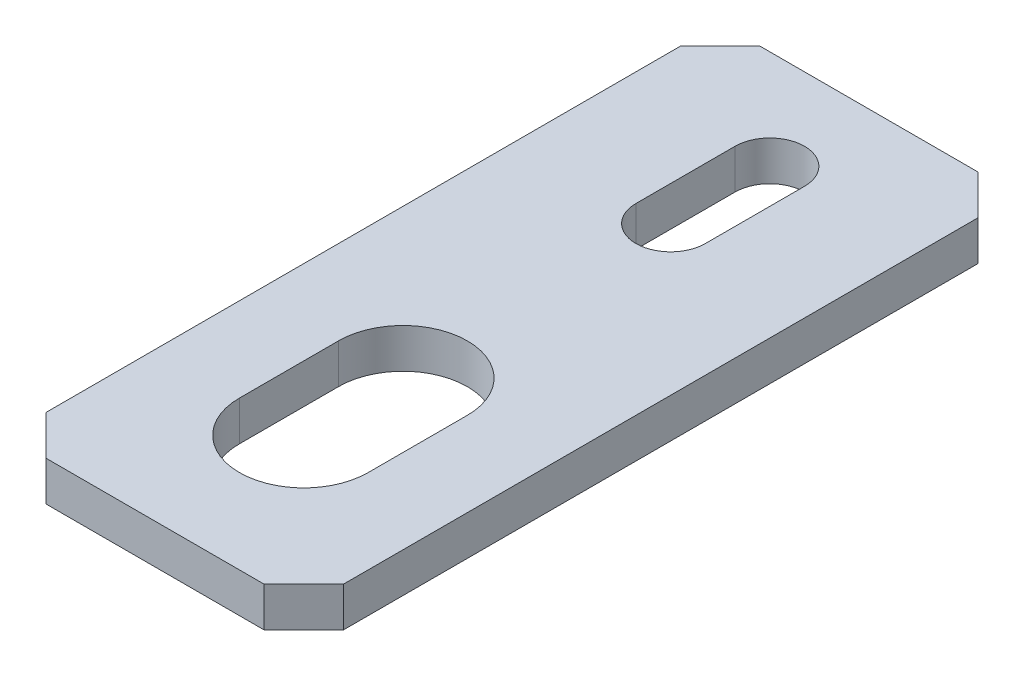
ISO-10303-21;
HEADER;
FILE_DESCRIPTION(('STEP AP214'),'2;1');
FILE_NAME('part.step','',(''),(''),'','','');
FILE_SCHEMA(('AUTOMOTIVE_DESIGN { 1 0 10303 214 1 1 1 1 }'));
ENDSEC;
DATA;
#1=APPLICATION_CONTEXT('core data for automotive mechanical design processes');
#2=APPLICATION_PROTOCOL_DEFINITION('international standard','automotive_design',2000,#1);
#3=PRODUCT_CONTEXT('',#1,'mechanical');
#4=PRODUCT('Part','Part','',(#3));
#5=PRODUCT_RELATED_PRODUCT_CATEGORY('part','',(#4));
#6=PRODUCT_DEFINITION_FORMATION('','',#4);
#7=PRODUCT_DEFINITION_CONTEXT('part definition',#1,'design');
#8=PRODUCT_DEFINITION('design','',#6,#7);
#9=PRODUCT_DEFINITION_SHAPE('','',#8);
#10=(LENGTH_UNIT() NAMED_UNIT(*) SI_UNIT(.MILLI.,.METRE.));
#11=(NAMED_UNIT(*) PLANE_ANGLE_UNIT() SI_UNIT($,.RADIAN.));
#12=(NAMED_UNIT(*) SI_UNIT($,.STERADIAN.) SOLID_ANGLE_UNIT());
#13=UNCERTAINTY_MEASURE_WITH_UNIT(LENGTH_MEASURE(1.E-05),#10,'distance_accuracy_value','');
#14=(GEOMETRIC_REPRESENTATION_CONTEXT(3) GLOBAL_UNCERTAINTY_ASSIGNED_CONTEXT((#13)) GLOBAL_UNIT_ASSIGNED_CONTEXT((#10,
#11,#12)) REPRESENTATION_CONTEXT('',''));
#15=CARTESIAN_POINT('',(0.,0.,0.));
#16=DIRECTION('',(0.,0.,1.));
#17=DIRECTION('',(1.,0.,0.));
#18=AXIS2_PLACEMENT_3D('',#15,#16,#17);
#19=CARTESIAN_POINT('',(-13.,2.,-36.));
#20=DIRECTION('',(0.707106781186548,0.,0.707106781186547));
#21=DIRECTION('',(0.707106781186547,0.,-0.707106781186548));
#22=AXIS2_PLACEMENT_3D('',#19,#20,#21);
#23=PLANE('',#22);
#24=DIRECTION('',(-0.707106781186547,0.,0.707106781186548));
#25=VECTOR('',#24,1.);
#26=CARTESIAN_POINT('',(-13.,0.,-36.));
#27=LINE('',#26,#25);
#28=CARTESIAN_POINT('',(-13.,0.,-36.));
#29=VERTEX_POINT('',#28);
#30=CARTESIAN_POINT('',(-15.,0.,-34.));
#31=VERTEX_POINT('',#30);
#32=EDGE_CURVE('E11',#29,#31,#27,.T.);
#33=ORIENTED_EDGE('',*,*,#32,.T.);
#34=DIRECTION('',(0.,-1.,0.));
#35=VECTOR('',#34,1.);
#36=CARTESIAN_POINT('',(-15.,2.,-34.));
#37=LINE('',#36,#35);
#38=CARTESIAN_POINT('',(-15.,2.,-34.));
#39=VERTEX_POINT('',#38);
#40=EDGE_CURVE('E25',#39,#31,#37,.T.);
#41=ORIENTED_EDGE('',*,*,#40,.F.);
#42=DIRECTION('',(-0.707106781186547,0.,0.707106781186548));
#43=VECTOR('',#42,1.);
#44=CARTESIAN_POINT('',(-13.,2.,-36.));
#45=LINE('',#44,#43);
#46=CARTESIAN_POINT('',(-13.,2.,-36.));
#47=VERTEX_POINT('',#46);
#48=EDGE_CURVE('E343',#47,#39,#45,.T.);
#49=ORIENTED_EDGE('',*,*,#48,.F.);
#50=DIRECTION('',(0.,-1.,0.));
#51=VECTOR('',#50,1.);
#52=CARTESIAN_POINT('',(-13.,2.,-36.));
#53=LINE('',#52,#51);
#54=EDGE_CURVE('E339',#47,#29,#53,.T.);
#55=ORIENTED_EDGE('',*,*,#54,.T.);
#56=EDGE_LOOP('',(#33,#41,#49,#55));
#57=FACE_BOUND('',#56,.T.);
#58=ADVANCED_FACE('F17',(#57),#23,.F.);
#59=CARTESIAN_POINT('',(-2.,2.,-36.));
#60=DIRECTION('',(0.,0.,1.));
#61=DIRECTION('',(1.,0.,0.));
#62=AXIS2_PLACEMENT_3D('',#59,#60,#61);
#63=PLANE('',#62);
#64=DIRECTION('',(-1.,0.,0.));
#65=VECTOR('',#64,1.);
#66=CARTESIAN_POINT('',(-2.,0.,-36.));
#67=LINE('',#66,#65);
#68=CARTESIAN_POINT('',(-2.,0.,-36.));
#69=VERTEX_POINT('',#68);
#70=EDGE_CURVE('E334',#69,#29,#67,.T.);
#71=ORIENTED_EDGE('',*,*,#70,.T.);
#72=ORIENTED_EDGE('',*,*,#54,.F.);
#73=DIRECTION('',(-1.,0.,0.));
#74=VECTOR('',#73,1.);
#75=CARTESIAN_POINT('',(-2.,2.,-36.));
#76=LINE('',#75,#74);
#77=CARTESIAN_POINT('',(-2.,2.,-36.));
#78=VERTEX_POINT('',#77);
#79=EDGE_CURVE('E329',#78,#47,#76,.T.);
#80=ORIENTED_EDGE('',*,*,#79,.F.);
#81=DIRECTION('',(0.,-1.,0.));
#82=VECTOR('',#81,1.);
#83=CARTESIAN_POINT('',(-2.,2.,-36.));
#84=LINE('',#83,#82);
#85=EDGE_CURVE('E325',#78,#69,#84,.T.);
#86=ORIENTED_EDGE('',*,*,#85,.T.);
#87=EDGE_LOOP('',(#71,#72,#80,#86));
#88=FACE_BOUND('',#87,.T.);
#89=ADVANCED_FACE('F361',(#88),#63,.F.);
#90=CARTESIAN_POINT('',(0.,2.,-34.));
#91=DIRECTION('',(-0.707106781186548,0.,0.707106781186547));
#92=DIRECTION('',(0.707106781186547,0.,0.707106781186548));
#93=AXIS2_PLACEMENT_3D('',#90,#91,#92);
#94=PLANE('',#93);
#95=DIRECTION('',(-0.707106781186547,0.,-0.707106781186548));
#96=VECTOR('',#95,1.);
#97=CARTESIAN_POINT('',(0.,0.,-34.));
#98=LINE('',#97,#96);
#99=CARTESIAN_POINT('',(0.,0.,-34.));
#100=VERTEX_POINT('',#99);
#101=EDGE_CURVE('E320',#100,#69,#98,.T.);
#102=ORIENTED_EDGE('',*,*,#101,.T.);
#103=ORIENTED_EDGE('',*,*,#85,.F.);
#104=DIRECTION('',(-0.707106781186547,0.,-0.707106781186548));
#105=VECTOR('',#104,1.);
#106=CARTESIAN_POINT('',(0.,2.,-34.));
#107=LINE('',#106,#105);
#108=CARTESIAN_POINT('',(0.,2.,-34.));
#109=VERTEX_POINT('',#108);
#110=EDGE_CURVE('E315',#109,#78,#107,.T.);
#111=ORIENTED_EDGE('',*,*,#110,.F.);
#112=DIRECTION('',(0.,-1.,0.));
#113=VECTOR('',#112,1.);
#114=CARTESIAN_POINT('',(0.,2.,-34.));
#115=LINE('',#114,#113);
#116=EDGE_CURVE('E311',#109,#100,#115,.T.);
#117=ORIENTED_EDGE('',*,*,#116,.T.);
#118=EDGE_LOOP('',(#102,#103,#111,#117));
#119=FACE_BOUND('',#118,.T.);
#120=ADVANCED_FACE('F381',(#119),#94,.F.);
#121=CARTESIAN_POINT('',(0.,2.,-2.));
#122=DIRECTION('',(-1.,0.,0.));
#123=DIRECTION('',(0.,0.,1.));
#124=AXIS2_PLACEMENT_3D('',#121,#122,#123);
#125=PLANE('',#124);
#126=DIRECTION('',(0.,0.,-1.));
#127=VECTOR('',#126,1.);
#128=CARTESIAN_POINT('',(0.,0.,-2.));
#129=LINE('',#128,#127);
#130=CARTESIAN_POINT('',(0.,0.,-2.));
#131=VERTEX_POINT('',#130);
#132=EDGE_CURVE('E306',#131,#100,#129,.T.);
#133=ORIENTED_EDGE('',*,*,#132,.T.);
#134=ORIENTED_EDGE('',*,*,#116,.F.);
#135=DIRECTION('',(0.,0.,-1.));
#136=VECTOR('',#135,1.);
#137=CARTESIAN_POINT('',(0.,2.,-2.));
#138=LINE('',#137,#136);
#139=CARTESIAN_POINT('',(0.,2.,-2.));
#140=VERTEX_POINT('',#139);
#141=EDGE_CURVE('E301',#140,#109,#138,.T.);
#142=ORIENTED_EDGE('',*,*,#141,.F.);
#143=DIRECTION('',(0.,-1.,0.));
#144=VECTOR('',#143,1.);
#145=CARTESIAN_POINT('',(0.,2.,-2.));
#146=LINE('',#145,#144);
#147=EDGE_CURVE('E297',#140,#131,#146,.T.);
#148=ORIENTED_EDGE('',*,*,#147,.T.);
#149=EDGE_LOOP('',(#133,#134,#142,#148));
#150=FACE_BOUND('',#149,.T.);
#151=ADVANCED_FACE('F378',(#150),#125,.F.);
#152=CARTESIAN_POINT('',(-2.,2.,0.));
#153=DIRECTION('',(-0.707106781186548,0.,-0.707106781186548));
#154=DIRECTION('',(-0.707106781186548,0.,0.707106781186548));
#155=AXIS2_PLACEMENT_3D('',#152,#153,#154);
#156=PLANE('',#155);
#157=DIRECTION('',(0.707106781186548,0.,-0.707106781186548));
#158=VECTOR('',#157,1.);
#159=CARTESIAN_POINT('',(-2.,0.,0.));
#160=LINE('',#159,#158);
#161=CARTESIAN_POINT('',(-2.,0.,0.));
#162=VERTEX_POINT('',#161);
#163=EDGE_CURVE('E292',#162,#131,#160,.T.);
#164=ORIENTED_EDGE('',*,*,#163,.T.);
#165=ORIENTED_EDGE('',*,*,#147,.F.);
#166=DIRECTION('',(0.707106781186548,0.,-0.707106781186548));
#167=VECTOR('',#166,1.);
#168=CARTESIAN_POINT('',(-2.,2.,0.));
#169=LINE('',#168,#167);
#170=CARTESIAN_POINT('',(-2.,2.,0.));
#171=VERTEX_POINT('',#170);
#172=EDGE_CURVE('E287',#171,#140,#169,.T.);
#173=ORIENTED_EDGE('',*,*,#172,.F.);
#174=DIRECTION('',(0.,-1.,0.));
#175=VECTOR('',#174,1.);
#176=CARTESIAN_POINT('',(-2.,2.,0.));
#177=LINE('',#176,#175);
#178=EDGE_CURVE('E283',#171,#162,#177,.T.);
#179=ORIENTED_EDGE('',*,*,#178,.T.);
#180=EDGE_LOOP('',(#164,#165,#173,#179));
#181=FACE_BOUND('',#180,.T.);
#182=ADVANCED_FACE('F375',(#181),#156,.F.);
#183=CARTESIAN_POINT('',(-13.,2.,0.));
#184=DIRECTION('',(0.,0.,-1.));
#185=DIRECTION('',(-1.,0.,0.));
#186=AXIS2_PLACEMENT_3D('',#183,#184,#185);
#187=PLANE('',#186);
#188=DIRECTION('',(1.,0.,0.));
#189=VECTOR('',#188,1.);
#190=CARTESIAN_POINT('',(-13.,0.,0.));
#191=LINE('',#190,#189);
#192=CARTESIAN_POINT('',(-13.,0.,0.));
#193=VERTEX_POINT('',#192);
#194=EDGE_CURVE('E278',#193,#162,#191,.T.);
#195=ORIENTED_EDGE('',*,*,#194,.T.);
#196=ORIENTED_EDGE('',*,*,#178,.F.);
#197=DIRECTION('',(1.,0.,0.));
#198=VECTOR('',#197,1.);
#199=CARTESIAN_POINT('',(-13.,2.,0.));
#200=LINE('',#199,#198);
#201=CARTESIAN_POINT('',(-13.,2.,0.));
#202=VERTEX_POINT('',#201);
#203=EDGE_CURVE('E273',#202,#171,#200,.T.);
#204=ORIENTED_EDGE('',*,*,#203,.F.);
#205=DIRECTION('',(0.,-1.,0.));
#206=VECTOR('',#205,1.);
#207=CARTESIAN_POINT('',(-13.,2.,0.));
#208=LINE('',#207,#206);
#209=EDGE_CURVE('E269',#202,#193,#208,.T.);
#210=ORIENTED_EDGE('',*,*,#209,.T.);
#211=EDGE_LOOP('',(#195,#196,#204,#210));
#212=FACE_BOUND('',#211,.T.);
#213=ADVANCED_FACE('F373',(#212),#187,.F.);
#214=CARTESIAN_POINT('',(-15.,2.,-2.));
#215=DIRECTION('',(0.707106781186548,0.,-0.707106781186547));
#216=DIRECTION('',(-0.707106781186547,0.,-0.707106781186548));
#217=AXIS2_PLACEMENT_3D('',#214,#215,#216);
#218=PLANE('',#217);
#219=DIRECTION('',(0.707106781186547,0.,0.707106781186548));
#220=VECTOR('',#219,1.);
#221=CARTESIAN_POINT('',(-15.,0.,-2.));
#222=LINE('',#221,#220);
#223=CARTESIAN_POINT('',(-15.,0.,-2.));
#224=VERTEX_POINT('',#223);
#225=EDGE_CURVE('E264',#224,#193,#222,.T.);
#226=ORIENTED_EDGE('',*,*,#225,.T.);
#227=ORIENTED_EDGE('',*,*,#209,.F.);
#228=DIRECTION('',(0.707106781186547,0.,0.707106781186548));
#229=VECTOR('',#228,1.);
#230=CARTESIAN_POINT('',(-15.,2.,-2.));
#231=LINE('',#230,#229);
#232=CARTESIAN_POINT('',(-15.,2.,-2.));
#233=VERTEX_POINT('',#232);
#234=EDGE_CURVE('E259',#233,#202,#231,.T.);
#235=ORIENTED_EDGE('',*,*,#234,.F.);
#236=DIRECTION('',(0.,-1.,0.));
#237=VECTOR('',#236,1.);
#238=CARTESIAN_POINT('',(-15.,2.,-2.));
#239=LINE('',#238,#237);
#240=EDGE_CURVE('E255',#233,#224,#239,.T.);
#241=ORIENTED_EDGE('',*,*,#240,.T.);
#242=EDGE_LOOP('',(#226,#227,#235,#241));
#243=FACE_BOUND('',#242,.T.);
#244=ADVANCED_FACE('F369',(#243),#218,.F.);
#245=CARTESIAN_POINT('',(-15.,2.,-34.));
#246=DIRECTION('',(1.,0.,0.));
#247=DIRECTION('',(0.,0.,-1.));
#248=AXIS2_PLACEMENT_3D('',#245,#246,#247);
#249=PLANE('',#248);
#250=DIRECTION('',(0.,0.,1.));
#251=VECTOR('',#250,1.);
#252=CARTESIAN_POINT('',(-15.,0.,-34.));
#253=LINE('',#252,#251);
#254=EDGE_CURVE('E250',#31,#224,#253,.T.);
#255=ORIENTED_EDGE('',*,*,#254,.T.);
#256=ORIENTED_EDGE('',*,*,#240,.F.);
#257=DIRECTION('',(0.,0.,1.));
#258=VECTOR('',#257,1.);
#259=CARTESIAN_POINT('',(-15.,2.,-34.));
#260=LINE('',#259,#258);
#261=EDGE_CURVE('E245',#39,#233,#260,.T.);
#262=ORIENTED_EDGE('',*,*,#261,.F.);
#263=ORIENTED_EDGE('',*,*,#40,.T.);
#264=EDGE_LOOP('',(#255,#256,#262,#263));
#265=FACE_BOUND('',#264,.T.);
#266=ADVANCED_FACE('F353',(#265),#249,.F.);
#267=CARTESIAN_POINT('',(0.,2.,0.));
#268=DIRECTION('',(0.,1.,0.));
#269=DIRECTION('',(0.,0.,1.));
#270=AXIS2_PLACEMENT_3D('',#267,#268,#269);
#271=PLANE('',#270);
#272=CARTESIAN_POINT('',(-7.5,2.,-26.));
#273=DIRECTION('',(0.,1.,0.));
#274=DIRECTION('',(1.,0.,0.));
#275=AXIS2_PLACEMENT_3D('',#272,#273,#274);
#276=CIRCLE('',#275,1.75);
#277=CARTESIAN_POINT('',(-9.25,2.,-26.));
#278=VERTEX_POINT('',#277);
#279=CARTESIAN_POINT('',(-5.75,2.,-26.));
#280=VERTEX_POINT('',#279);
#281=EDGE_CURVE('E240',#278,#280,#276,.T.);
#282=ORIENTED_EDGE('',*,*,#281,.F.);
#283=DIRECTION('',(0.,0.,1.));
#284=VECTOR('',#283,1.);
#285=CARTESIAN_POINT('',(-9.25,2.,-31.));
#286=LINE('',#285,#284);
#287=CARTESIAN_POINT('',(-9.25,2.,-31.));
#288=VERTEX_POINT('',#287);
#289=EDGE_CURVE('E236',#288,#278,#286,.T.);
#290=ORIENTED_EDGE('',*,*,#289,.F.);
#291=CARTESIAN_POINT('',(-7.5,2.,-31.));
#292=DIRECTION('',(0.,1.,0.));
#293=DIRECTION('',(1.,0.,0.));
#294=AXIS2_PLACEMENT_3D('',#291,#292,#293);
#295=CIRCLE('',#294,1.75);
#296=CARTESIAN_POINT('',(-5.75,2.,-31.));
#297=VERTEX_POINT('',#296);
#298=EDGE_CURVE('E152',#297,#288,#295,.T.);
#299=ORIENTED_EDGE('',*,*,#298,.F.);
#300=DIRECTION('',(0.,0.,-1.));
#301=VECTOR('',#300,1.);
#302=CARTESIAN_POINT('',(-5.75,2.,-26.));
#303=LINE('',#302,#301);
#304=EDGE_CURVE('E228',#280,#297,#303,.T.);
#305=ORIENTED_EDGE('',*,*,#304,.F.);
#306=EDGE_LOOP('',(#282,#290,#299,#305));
#307=FACE_BOUND('',#306,.T.);
#308=CARTESIAN_POINT('',(-7.5,2.,-7.5));
#309=DIRECTION('',(0.,1.,0.));
#310=DIRECTION('',(1.,0.,0.));
#311=AXIS2_PLACEMENT_3D('',#308,#309,#310);
#312=CIRCLE('',#311,3.25);
#313=CARTESIAN_POINT('',(-10.75,2.,-7.5));
#314=VERTEX_POINT('',#313);
#315=CARTESIAN_POINT('',(-4.25,2.,-7.5));
#316=VERTEX_POINT('',#315);
#317=EDGE_CURVE('E223',#314,#316,#312,.T.);
#318=ORIENTED_EDGE('',*,*,#317,.F.);
#319=DIRECTION('',(0.,0.,1.));
#320=VECTOR('',#319,1.);
#321=CARTESIAN_POINT('',(-10.75,2.,-12.5));
#322=LINE('',#321,#320);
#323=CARTESIAN_POINT('',(-10.75,2.,-12.5));
#324=VERTEX_POINT('',#323);
#325=EDGE_CURVE('E218',#324,#314,#322,.T.);
#326=ORIENTED_EDGE('',*,*,#325,.F.);
#327=CARTESIAN_POINT('',(-7.5,2.,-12.5));
#328=DIRECTION('',(0.,1.,0.));
#329=DIRECTION('',(1.,0.,0.));
#330=AXIS2_PLACEMENT_3D('',#327,#328,#329);
#331=CIRCLE('',#330,3.25);
#332=CARTESIAN_POINT('',(-4.25,2.,-12.5));
#333=VERTEX_POINT('',#332);
#334=EDGE_CURVE('E213',#333,#324,#331,.T.);
#335=ORIENTED_EDGE('',*,*,#334,.F.);
#336=DIRECTION('',(0.,0.,-1.));
#337=VECTOR('',#336,1.);
#338=CARTESIAN_POINT('',(-4.25,2.,-7.5));
#339=LINE('',#338,#337);
#340=EDGE_CURVE('E208',#316,#333,#339,.T.);
#341=ORIENTED_EDGE('',*,*,#340,.F.);
#342=EDGE_LOOP('',(#318,#326,#335,#341));
#343=FACE_BOUND('',#342,.T.);
#344=ORIENTED_EDGE('',*,*,#48,.T.);
#345=ORIENTED_EDGE('',*,*,#261,.T.);
#346=ORIENTED_EDGE('',*,*,#234,.T.);
#347=ORIENTED_EDGE('',*,*,#203,.T.);
#348=ORIENTED_EDGE('',*,*,#172,.T.);
#349=ORIENTED_EDGE('',*,*,#141,.T.);
#350=ORIENTED_EDGE('',*,*,#110,.T.);
#351=ORIENTED_EDGE('',*,*,#79,.T.);
#352=EDGE_LOOP('',(#344,#345,#346,#347,#348,#349,#350,#351));
#353=FACE_BOUND('',#352,.T.);
#354=ADVANCED_FACE('F357',(#307,#343,#353),#271,.T.);
#355=CARTESIAN_POINT('',(-4.25,2.,-7.5));
#356=DIRECTION('',(-1.,0.,0.));
#357=DIRECTION('',(0.,0.,1.));
#358=AXIS2_PLACEMENT_3D('',#355,#356,#357);
#359=PLANE('',#358);
#360=DIRECTION('',(0.,0.,-1.));
#361=VECTOR('',#360,1.);
#362=CARTESIAN_POINT('',(-4.25,0.,-7.5));
#363=LINE('',#362,#361);
#364=CARTESIAN_POINT('',(-4.25,0.,-7.5));
#365=VERTEX_POINT('',#364);
#366=CARTESIAN_POINT('',(-4.25,0.,-12.5));
#367=VERTEX_POINT('',#366);
#368=EDGE_CURVE('E203',#365,#367,#363,.T.);
#369=ORIENTED_EDGE('',*,*,#368,.F.);
#370=DIRECTION('',(0.,-1.,0.));
#371=VECTOR('',#370,1.);
#372=CARTESIAN_POINT('',(-4.25,2.,-7.5));
#373=LINE('',#372,#371);
#374=EDGE_CURVE('E198',#316,#365,#373,.T.);
#375=ORIENTED_EDGE('',*,*,#374,.F.);
#376=ORIENTED_EDGE('',*,*,#340,.T.);
#377=DIRECTION('',(0.,-1.,0.));
#378=VECTOR('',#377,1.);
#379=CARTESIAN_POINT('',(-4.25,2.,-12.5));
#380=LINE('',#379,#378);
#381=EDGE_CURVE('E194',#333,#367,#380,.T.);
#382=ORIENTED_EDGE('',*,*,#381,.T.);
#383=EDGE_LOOP('',(#369,#375,#376,#382));
#384=FACE_BOUND('',#383,.T.);
#385=ADVANCED_FACE('F460',(#384),#359,.T.);
#386=CARTESIAN_POINT('',(-7.5,2.,-12.5));
#387=DIRECTION('',(0.,-1.,0.));
#388=DIRECTION('',(0.,0.,1.));
#389=AXIS2_PLACEMENT_3D('',#386,#387,#388);
#390=CYLINDRICAL_SURFACE('',#389,3.25);
#391=CARTESIAN_POINT('',(-7.5,0.,-12.5));
#392=DIRECTION('',(0.,1.,0.));
#393=DIRECTION('',(1.,0.,0.));
#394=AXIS2_PLACEMENT_3D('',#391,#392,#393);
#395=CIRCLE('',#394,3.25);
#396=CARTESIAN_POINT('',(-10.75,0.,-12.5));
#397=VERTEX_POINT('',#396);
#398=EDGE_CURVE('E189',#367,#397,#395,.T.);
#399=ORIENTED_EDGE('',*,*,#398,.F.);
#400=ORIENTED_EDGE('',*,*,#381,.F.);
#401=ORIENTED_EDGE('',*,*,#334,.T.);
#402=DIRECTION('',(0.,-1.,0.));
#403=VECTOR('',#402,1.);
#404=CARTESIAN_POINT('',(-10.75,2.,-12.5));
#405=LINE('',#404,#403);
#406=EDGE_CURVE('E185',#324,#397,#405,.T.);
#407=ORIENTED_EDGE('',*,*,#406,.T.);
#408=EDGE_LOOP('',(#399,#400,#401,#407));
#409=FACE_BOUND('',#408,.T.);
#410=ADVANCED_FACE('F471',(#409),#390,.F.);
#411=CARTESIAN_POINT('',(-10.75,2.,-12.5));
#412=DIRECTION('',(1.,0.,0.));
#413=DIRECTION('',(0.,0.,-1.));
#414=AXIS2_PLACEMENT_3D('',#411,#412,#413);
#415=PLANE('',#414);
#416=DIRECTION('',(0.,0.,1.));
#417=VECTOR('',#416,1.);
#418=CARTESIAN_POINT('',(-10.75,0.,-12.5));
#419=LINE('',#418,#417);
#420=CARTESIAN_POINT('',(-10.75,0.,-7.5));
#421=VERTEX_POINT('',#420);
#422=EDGE_CURVE('E180',#397,#421,#419,.T.);
#423=ORIENTED_EDGE('',*,*,#422,.F.);
#424=ORIENTED_EDGE('',*,*,#406,.F.);
#425=ORIENTED_EDGE('',*,*,#325,.T.);
#426=DIRECTION('',(0.,-1.,0.));
#427=VECTOR('',#426,1.);
#428=CARTESIAN_POINT('',(-10.75,2.,-7.5));
#429=LINE('',#428,#427);
#430=EDGE_CURVE('E176',#314,#421,#429,.T.);
#431=ORIENTED_EDGE('',*,*,#430,.T.);
#432=EDGE_LOOP('',(#423,#424,#425,#431));
#433=FACE_BOUND('',#432,.T.);
#434=ADVANCED_FACE('F482',(#433),#415,.T.);
#435=CARTESIAN_POINT('',(-7.5,2.,-7.5));
#436=DIRECTION('',(0.,-1.,0.));
#437=DIRECTION('',(0.,0.,-1.));
#438=AXIS2_PLACEMENT_3D('',#435,#436,#437);
#439=CYLINDRICAL_SURFACE('',#438,3.25);
#440=CARTESIAN_POINT('',(-7.5,0.,-7.5));
#441=DIRECTION('',(0.,1.,0.));
#442=DIRECTION('',(1.,0.,0.));
#443=AXIS2_PLACEMENT_3D('',#440,#441,#442);
#444=CIRCLE('',#443,3.25);
#445=EDGE_CURVE('E148',#421,#365,#444,.T.);
#446=ORIENTED_EDGE('',*,*,#445,.F.);
#447=ORIENTED_EDGE('',*,*,#430,.F.);
#448=ORIENTED_EDGE('',*,*,#317,.T.);
#449=ORIENTED_EDGE('',*,*,#374,.T.);
#450=EDGE_LOOP('',(#446,#447,#448,#449));
#451=FACE_BOUND('',#450,.T.);
#452=ADVANCED_FACE('F493',(#451),#439,.F.);
#453=CARTESIAN_POINT('',(0.,0.,0.));
#454=DIRECTION('',(0.,1.,0.));
#455=DIRECTION('',(0.,0.,1.));
#456=AXIS2_PLACEMENT_3D('',#453,#454,#455);
#457=PLANE('',#456);
#458=DIRECTION('',(0.,0.,1.));
#459=VECTOR('',#458,1.);
#460=CARTESIAN_POINT('',(-9.25,0.,-31.));
#461=LINE('',#460,#459);
#462=CARTESIAN_POINT('',(-9.25,0.,-31.));
#463=VERTEX_POINT('',#462);
#464=CARTESIAN_POINT('',(-9.25,0.,-26.));
#465=VERTEX_POINT('',#464);
#466=EDGE_CURVE('E129',#463,#465,#461,.T.);
#467=ORIENTED_EDGE('',*,*,#466,.T.);
#468=CARTESIAN_POINT('',(-7.5,0.,-26.));
#469=DIRECTION('',(0.,1.,0.));
#470=DIRECTION('',(1.,0.,0.));
#471=AXIS2_PLACEMENT_3D('',#468,#469,#470);
#472=CIRCLE('',#471,1.75);
#473=CARTESIAN_POINT('',(-5.75,0.,-26.));
#474=VERTEX_POINT('',#473);
#475=EDGE_CURVE('E149',#465,#474,#472,.T.);
#476=ORIENTED_EDGE('',*,*,#475,.T.);
#477=DIRECTION('',(0.,0.,-1.));
#478=VECTOR('',#477,1.);
#479=CARTESIAN_POINT('',(-5.75,0.,-26.));
#480=LINE('',#479,#478);
#481=CARTESIAN_POINT('',(-5.75,0.,-31.));
#482=VERTEX_POINT('',#481);
#483=EDGE_CURVE('E132',#474,#482,#480,.T.);
#484=ORIENTED_EDGE('',*,*,#483,.T.);
#485=CARTESIAN_POINT('',(-7.5,0.,-31.));
#486=DIRECTION('',(0.,1.,0.));
#487=DIRECTION('',(1.,0.,0.));
#488=AXIS2_PLACEMENT_3D('',#485,#486,#487);
#489=CIRCLE('',#488,1.75);
#490=EDGE_CURVE('E125',#482,#463,#489,.T.);
#491=ORIENTED_EDGE('',*,*,#490,.T.);
#492=EDGE_LOOP('',(#467,#476,#484,#491));
#493=FACE_BOUND('',#492,.T.);
#494=ORIENTED_EDGE('',*,*,#422,.T.);
#495=ORIENTED_EDGE('',*,*,#445,.T.);
#496=ORIENTED_EDGE('',*,*,#368,.T.);
#497=ORIENTED_EDGE('',*,*,#398,.T.);
#498=EDGE_LOOP('',(#494,#495,#496,#497));
#499=FACE_BOUND('',#498,.T.);
#500=ORIENTED_EDGE('',*,*,#32,.F.);
#501=ORIENTED_EDGE('',*,*,#70,.F.);
#502=ORIENTED_EDGE('',*,*,#101,.F.);
#503=ORIENTED_EDGE('',*,*,#132,.F.);
#504=ORIENTED_EDGE('',*,*,#163,.F.);
#505=ORIENTED_EDGE('',*,*,#194,.F.);
#506=ORIENTED_EDGE('',*,*,#225,.F.);
#507=ORIENTED_EDGE('',*,*,#254,.F.);
#508=EDGE_LOOP('',(#500,#501,#502,#503,#504,#505,#506,#507));
#509=FACE_BOUND('',#508,.T.);
#510=ADVANCED_FACE('F127',(#493,#499,#509),#457,.F.);
#511=CARTESIAN_POINT('',(-7.5,2.,-31.));
#512=DIRECTION('',(0.,-1.,0.));
#513=DIRECTION('',(0.,0.,1.));
#514=AXIS2_PLACEMENT_3D('',#511,#512,#513);
#515=CYLINDRICAL_SURFACE('',#514,1.75);
#516=ORIENTED_EDGE('',*,*,#490,.F.);
#517=DIRECTION('',(0.,-1.,0.));
#518=VECTOR('',#517,1.);
#519=CARTESIAN_POINT('',(-5.75,2.,-31.));
#520=LINE('',#519,#518);
#521=EDGE_CURVE('E137',#297,#482,#520,.T.);
#522=ORIENTED_EDGE('',*,*,#521,.F.);
#523=ORIENTED_EDGE('',*,*,#298,.T.);
#524=DIRECTION('',(0.,-1.,0.));
#525=VECTOR('',#524,1.);
#526=CARTESIAN_POINT('',(-9.25,2.,-31.));
#527=LINE('',#526,#525);
#528=EDGE_CURVE('E143',#288,#463,#527,.T.);
#529=ORIENTED_EDGE('',*,*,#528,.T.);
#530=EDGE_LOOP('',(#516,#522,#523,#529));
#531=FACE_BOUND('',#530,.T.);
#532=ADVANCED_FACE('F151',(#531),#515,.F.);
#533=CARTESIAN_POINT('',(-9.25,2.,-31.));
#534=DIRECTION('',(1.,0.,0.));
#535=DIRECTION('',(0.,0.,-1.));
#536=AXIS2_PLACEMENT_3D('',#533,#534,#535);
#537=PLANE('',#536);
#538=ORIENTED_EDGE('',*,*,#466,.F.);
#539=ORIENTED_EDGE('',*,*,#528,.F.);
#540=ORIENTED_EDGE('',*,*,#289,.T.);
#541=DIRECTION('',(0.,-1.,0.));
#542=VECTOR('',#541,1.);
#543=CARTESIAN_POINT('',(-9.25,2.,-26.));
#544=LINE('',#543,#542);
#545=EDGE_CURVE('E146',#278,#465,#544,.T.);
#546=ORIENTED_EDGE('',*,*,#545,.T.);
#547=EDGE_LOOP('',(#538,#539,#540,#546));
#548=FACE_BOUND('',#547,.T.);
#549=ADVANCED_FACE('F141',(#548),#537,.T.);
#550=CARTESIAN_POINT('',(-7.5,2.,-26.));
#551=DIRECTION('',(0.,-1.,0.));
#552=DIRECTION('',(0.,0.,-1.));
#553=AXIS2_PLACEMENT_3D('',#550,#551,#552);
#554=CYLINDRICAL_SURFACE('',#553,1.75);
#555=ORIENTED_EDGE('',*,*,#475,.F.);
#556=ORIENTED_EDGE('',*,*,#545,.F.);
#557=ORIENTED_EDGE('',*,*,#281,.T.);
#558=DIRECTION('',(0.,-1.,0.));
#559=VECTOR('',#558,1.);
#560=CARTESIAN_POINT('',(-5.75,2.,-26.));
#561=LINE('',#560,#559);
#562=EDGE_CURVE('E155',#280,#474,#561,.T.);
#563=ORIENTED_EDGE('',*,*,#562,.T.);
#564=EDGE_LOOP('',(#555,#556,#557,#563));
#565=FACE_BOUND('',#564,.T.);
#566=ADVANCED_FACE('F532',(#565),#554,.F.);
#567=CARTESIAN_POINT('',(-5.75,2.,-26.));
#568=DIRECTION('',(-1.,0.,0.));
#569=DIRECTION('',(0.,0.,1.));
#570=AXIS2_PLACEMENT_3D('',#567,#568,#569);
#571=PLANE('',#570);
#572=ORIENTED_EDGE('',*,*,#483,.F.);
#573=ORIENTED_EDGE('',*,*,#562,.F.);
#574=ORIENTED_EDGE('',*,*,#304,.T.);
#575=ORIENTED_EDGE('',*,*,#521,.T.);
#576=EDGE_LOOP('',(#572,#573,#574,#575));
#577=FACE_BOUND('',#576,.T.);
#578=ADVANCED_FACE('F542',(#577),#571,.T.);
#579=CLOSED_SHELL('',(#58,#89,#120,#151,#182,#213,#244,#266,#354,#385,#410,#434,#452,#510,#532,
#549,#566,#578));
#580=MANIFOLD_SOLID_BREP('B1',#579);
#581=ADVANCED_BREP_SHAPE_REPRESENTATION('',(#18,#580),#14);
#582=SHAPE_DEFINITION_REPRESENTATION(#9,#581);
ENDSEC;
END-ISO-10303-21;
